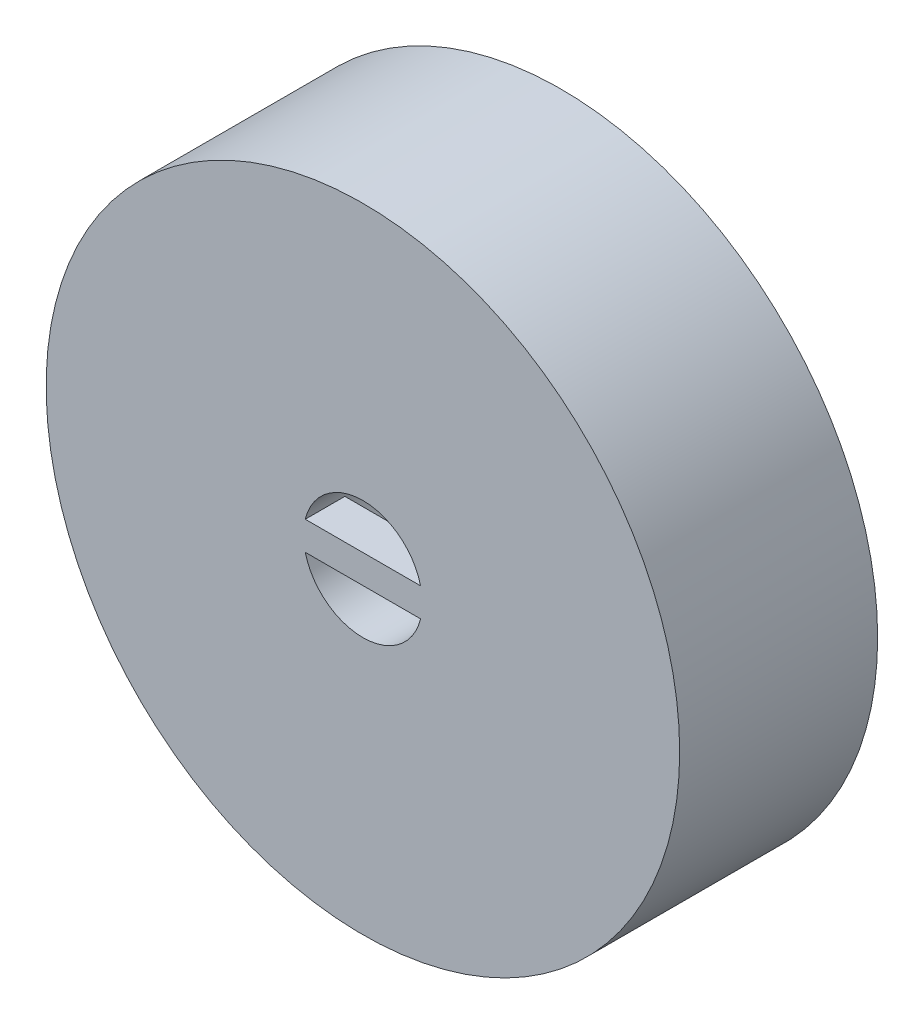
ISO-10303-21;
HEADER;
FILE_DESCRIPTION(('STEP AP214'),'2;1');
FILE_NAME('part.step','',(''),(''),'','','');
FILE_SCHEMA(('AUTOMOTIVE_DESIGN { 1 0 10303 214 1 1 1 1 }'));
ENDSEC;
DATA;
#1=APPLICATION_CONTEXT('core data for automotive mechanical design processes');
#2=APPLICATION_PROTOCOL_DEFINITION('international standard','automotive_design',2000,#1);
#3=PRODUCT_CONTEXT('',#1,'mechanical');
#4=PRODUCT('Part','Part','',(#3));
#5=PRODUCT_RELATED_PRODUCT_CATEGORY('part','',(#4));
#6=PRODUCT_DEFINITION_FORMATION('','',#4);
#7=PRODUCT_DEFINITION_CONTEXT('part definition',#1,'design');
#8=PRODUCT_DEFINITION('design','',#6,#7);
#9=PRODUCT_DEFINITION_SHAPE('','',#8);
#10=(LENGTH_UNIT() NAMED_UNIT(*) SI_UNIT(.MILLI.,.METRE.));
#11=(NAMED_UNIT(*) PLANE_ANGLE_UNIT() SI_UNIT($,.RADIAN.));
#12=(NAMED_UNIT(*) SI_UNIT($,.STERADIAN.) SOLID_ANGLE_UNIT());
#13=UNCERTAINTY_MEASURE_WITH_UNIT(LENGTH_MEASURE(1.E-05),#10,'distance_accuracy_value','');
#14=(GEOMETRIC_REPRESENTATION_CONTEXT(3) GLOBAL_UNCERTAINTY_ASSIGNED_CONTEXT((#13)) GLOBAL_UNIT_ASSIGNED_CONTEXT((#10,
#11,#12)) REPRESENTATION_CONTEXT('',''));
#15=CARTESIAN_POINT('',(0.,0.,0.));
#16=DIRECTION('',(0.,0.,1.));
#17=DIRECTION('',(1.,0.,0.));
#18=AXIS2_PLACEMENT_3D('',#15,#16,#17);
#19=CARTESIAN_POINT('',(0.,0.,1.));
#20=DIRECTION('',(0.,0.,1.));
#21=DIRECTION('',(1.,0.,0.));
#22=AXIS2_PLACEMENT_3D('',#19,#20,#21);
#23=PLANE('',#22);
#24=DIRECTION('',(1.,0.,0.));
#25=VECTOR('',#24,1.);
#26=CARTESIAN_POINT('',(0.,0.0451632546348679,1.));
#27=LINE('',#26,#25);
#28=CARTESIAN_POINT('',(-0.181979478048449,0.0451632546348679,1.));
#29=VERTEX_POINT('',#28);
#30=CARTESIAN_POINT('',(0.181979478048449,0.0451632546348679,1.));
#31=VERTEX_POINT('',#30);
#32=EDGE_CURVE('E55',#29,#31,#27,.T.);
#33=ORIENTED_EDGE('',*,*,#32,.F.);
#34=CARTESIAN_POINT('',(0.,0.,1.));
#35=DIRECTION('',(0.,0.,1.));
#36=DIRECTION('',(1.,0.,0.));
#37=AXIS2_PLACEMENT_3D('',#34,#35,#36);
#38=CIRCLE('',#37,0.1875);
#39=EDGE_CURVE('E92',#31,#29,#38,.T.);
#40=ORIENTED_EDGE('',*,*,#39,.F.);
#41=EDGE_LOOP('',(#33,#40));
#42=FACE_BOUND('',#41,.T.);
#43=CARTESIAN_POINT('',(0.,0.,1.));
#44=DIRECTION('',(0.,0.,1.));
#45=DIRECTION('',(1.,0.,0.));
#46=AXIS2_PLACEMENT_3D('',#43,#44,#45);
#47=CIRCLE('',#46,1.);
#48=CARTESIAN_POINT('',(1.,0.,1.));
#49=VERTEX_POINT('',#48);
#50=EDGE_CURVE('E134',#49,#49,#47,.T.);
#51=ORIENTED_EDGE('',*,*,#50,.T.);
#52=EDGE_LOOP('',(#51));
#53=FACE_BOUND('',#52,.T.);
#54=CARTESIAN_POINT('',(0.,0.,1.));
#55=DIRECTION('',(0.,0.,1.));
#56=DIRECTION('',(1.,0.,0.));
#57=AXIS2_PLACEMENT_3D('',#54,#55,#56);
#58=CIRCLE('',#57,0.1875);
#59=CARTESIAN_POINT('',(-0.181979478048449,-0.0451632546348679,1.));
#60=VERTEX_POINT('',#59);
#61=CARTESIAN_POINT('',(0.181979478048449,-0.0451632546348679,1.));
#62=VERTEX_POINT('',#61);
#63=EDGE_CURVE('E118',#60,#62,#58,.T.);
#64=ORIENTED_EDGE('',*,*,#63,.F.);
#65=DIRECTION('',(1.,0.,0.));
#66=VECTOR('',#65,1.);
#67=CARTESIAN_POINT('',(0.,-0.0451632546348679,1.));
#68=LINE('',#67,#66);
#69=EDGE_CURVE('E63',#60,#62,#68,.T.);
#70=ORIENTED_EDGE('',*,*,#69,.T.);
#71=EDGE_LOOP('',(#64,#70));
#72=FACE_BOUND('',#71,.T.);
#73=ADVANCED_FACE('F39',(#42,#53,#72),#23,.T.);
#74=CARTESIAN_POINT('',(0.,0.,1.));
#75=DIRECTION('',(0.,0.,-1.));
#76=DIRECTION('',(-1.,0.,0.));
#77=AXIS2_PLACEMENT_3D('',#74,#75,#76);
#78=CYLINDRICAL_SURFACE('',#77,1.);
#79=CARTESIAN_POINT('',(0.,0.,0.375));
#80=DIRECTION('',(0.,0.,1.));
#81=DIRECTION('',(1.,0.,0.));
#82=AXIS2_PLACEMENT_3D('',#79,#80,#81);
#83=CIRCLE('',#82,1.);
#84=CARTESIAN_POINT('',(1.,0.,0.375));
#85=VERTEX_POINT('',#84);
#86=EDGE_CURVE('E130',#85,#85,#83,.T.);
#87=ORIENTED_EDGE('',*,*,#86,.T.);
#88=EDGE_LOOP('',(#87));
#89=FACE_BOUND('',#88,.T.);
#90=ORIENTED_EDGE('',*,*,#50,.F.);
#91=EDGE_LOOP('',(#90));
#92=FACE_BOUND('',#91,.T.);
#93=ADVANCED_FACE('F158',(#89,#92),#78,.T.);
#94=CARTESIAN_POINT('',(0.,0.,0.375));
#95=DIRECTION('',(0.,0.,1.));
#96=DIRECTION('',(1.,0.,0.));
#97=AXIS2_PLACEMENT_3D('',#94,#95,#96);
#98=PLANE('',#97);
#99=CARTESIAN_POINT('',(0.,0.,0.375));
#100=DIRECTION('',(0.,0.,1.));
#101=DIRECTION('',(1.,0.,0.));
#102=AXIS2_PLACEMENT_3D('',#99,#100,#101);
#103=CIRCLE('',#102,0.475);
#104=CARTESIAN_POINT('',(0.475,0.,0.375));
#105=VERTEX_POINT('',#104);
#106=EDGE_CURVE('E48',#105,#105,#103,.T.);
#107=ORIENTED_EDGE('',*,*,#106,.T.);
#108=EDGE_LOOP('',(#107));
#109=FACE_BOUND('',#108,.T.);
#110=ORIENTED_EDGE('',*,*,#86,.F.);
#111=EDGE_LOOP('',(#110));
#112=FACE_BOUND('',#111,.T.);
#113=ADVANCED_FACE('F141',(#109,#112),#98,.F.);
#114=CARTESIAN_POINT('',(0.,0.,0.375));
#115=DIRECTION('',(0.,0.,-1.));
#116=DIRECTION('',(-1.,0.,0.));
#117=AXIS2_PLACEMENT_3D('',#114,#115,#116);
#118=CYLINDRICAL_SURFACE('',#117,0.375);
#119=CARTESIAN_POINT('',(0.,0.,0.275));
#120=DIRECTION('',(0.,0.,1.));
#121=DIRECTION('',(1.,0.,0.));
#122=AXIS2_PLACEMENT_3D('',#119,#120,#121);
#123=CIRCLE('',#122,0.375);
#124=CARTESIAN_POINT('',(0.375,0.,0.275));
#125=VERTEX_POINT('',#124);
#126=EDGE_CURVE('E11',#125,#125,#123,.F.);
#127=ORIENTED_EDGE('',*,*,#126,.T.);
#128=EDGE_LOOP('',(#127));
#129=FACE_BOUND('',#128,.T.);
#130=CARTESIAN_POINT('',(0.,0.,0.));
#131=DIRECTION('',(0.,0.,1.));
#132=DIRECTION('',(1.,0.,0.));
#133=AXIS2_PLACEMENT_3D('',#130,#131,#132);
#134=CIRCLE('',#133,0.375);
#135=CARTESIAN_POINT('',(0.375,0.,0.));
#136=VERTEX_POINT('',#135);
#137=EDGE_CURVE('E110',#136,#136,#134,.T.);
#138=ORIENTED_EDGE('',*,*,#137,.T.);
#139=EDGE_LOOP('',(#138));
#140=FACE_BOUND('',#139,.T.);
#141=ADVANCED_FACE('F153',(#129,#140),#118,.T.);
#142=CARTESIAN_POINT('',(0.,0.,0.));
#143=DIRECTION('',(0.,0.,1.));
#144=DIRECTION('',(1.,0.,0.));
#145=AXIS2_PLACEMENT_3D('',#142,#143,#144);
#146=PLANE('',#145);
#147=CARTESIAN_POINT('',(0.,0.,0.));
#148=DIRECTION('',(0.,0.,1.));
#149=DIRECTION('',(1.,0.,0.));
#150=AXIS2_PLACEMENT_3D('',#147,#148,#149);
#151=CIRCLE('',#150,0.1875);
#152=CARTESIAN_POINT('',(0.1875,0.,0.));
#153=VERTEX_POINT('',#152);
#154=EDGE_CURVE('E103',#153,#153,#151,.T.);
#155=ORIENTED_EDGE('',*,*,#154,.T.);
#156=EDGE_LOOP('',(#155));
#157=FACE_BOUND('',#156,.T.);
#158=ORIENTED_EDGE('',*,*,#137,.F.);
#159=EDGE_LOOP('',(#158));
#160=FACE_BOUND('',#159,.T.);
#161=ADVANCED_FACE('F146',(#157,#160),#146,.F.);
#162=CARTESIAN_POINT('',(0.,0.,0.275));
#163=DIRECTION('',(0.,0.,1.));
#164=DIRECTION('',(1.,0.,0.));
#165=AXIS2_PLACEMENT_3D('',#162,#163,#164);
#166=TOROIDAL_SURFACE('',#165,0.475,0.1);
#167=ORIENTED_EDGE('',*,*,#126,.F.);
#168=EDGE_LOOP('',(#167));
#169=FACE_BOUND('',#168,.T.);
#170=ORIENTED_EDGE('',*,*,#106,.F.);
#171=EDGE_LOOP('',(#170));
#172=FACE_BOUND('',#171,.T.);
#173=ADVANCED_FACE('F41',(#169,#172),#166,.F.);
#174=CARTESIAN_POINT('',(0.,-0.0451632546348679,0.875));
#175=DIRECTION('',(0.,-1.,0.));
#176=DIRECTION('',(0.,0.,-1.));
#177=AXIS2_PLACEMENT_3D('',#174,#175,#176);
#178=PLANE('',#177);
#179=ORIENTED_EDGE('',*,*,#69,.F.);
#180=DIRECTION('',(0.,0.,1.));
#181=VECTOR('',#180,1.);
#182=CARTESIAN_POINT('',(-0.181979478048449,-0.0451632546348679,0.875));
#183=LINE('',#182,#181);
#184=CARTESIAN_POINT('',(-0.181979478048449,-0.0451632546348679,0.875));
#185=VERTEX_POINT('',#184);
#186=EDGE_CURVE('E117',#185,#60,#183,.T.);
#187=ORIENTED_EDGE('',*,*,#186,.F.);
#188=DIRECTION('',(1.,0.,0.));
#189=VECTOR('',#188,1.);
#190=CARTESIAN_POINT('',(0.,-0.0451632546348679,0.875));
#191=LINE('',#190,#189);
#192=CARTESIAN_POINT('',(0.181979478048449,-0.0451632546348679,0.875));
#193=VERTEX_POINT('',#192);
#194=EDGE_CURVE('E114',#185,#193,#191,.T.);
#195=ORIENTED_EDGE('',*,*,#194,.T.);
#196=DIRECTION('',(0.,0.,1.));
#197=VECTOR('',#196,1.);
#198=CARTESIAN_POINT('',(0.181979478048449,-0.0451632546348679,0.875));
#199=LINE('',#198,#197);
#200=EDGE_CURVE('E101',#193,#62,#199,.T.);
#201=ORIENTED_EDGE('',*,*,#200,.T.);
#202=EDGE_LOOP('',(#179,#187,#195,#201));
#203=FACE_BOUND('',#202,.T.);
#204=ADVANCED_FACE('F145',(#203),#178,.T.);
#205=CARTESIAN_POINT('',(0.,0.0451632546348679,0.875));
#206=DIRECTION('',(0.,-1.,0.));
#207=DIRECTION('',(0.,0.,-1.));
#208=AXIS2_PLACEMENT_3D('',#205,#206,#207);
#209=PLANE('',#208);
#210=ORIENTED_EDGE('',*,*,#32,.T.);
#211=DIRECTION('',(0.,0.,1.));
#212=VECTOR('',#211,1.);
#213=CARTESIAN_POINT('',(0.181979478048449,0.0451632546348679,0.875));
#214=LINE('',#213,#212);
#215=CARTESIAN_POINT('',(0.181979478048449,0.0451632546348679,0.875));
#216=VERTEX_POINT('',#215);
#217=EDGE_CURVE('E91',#216,#31,#214,.T.);
#218=ORIENTED_EDGE('',*,*,#217,.F.);
#219=DIRECTION('',(1.,0.,0.));
#220=VECTOR('',#219,1.);
#221=CARTESIAN_POINT('',(0.,0.0451632546348679,0.875));
#222=LINE('',#221,#220);
#223=CARTESIAN_POINT('',(-0.181979478048449,0.0451632546348679,0.875));
#224=VERTEX_POINT('',#223);
#225=EDGE_CURVE('E82',#224,#216,#222,.T.);
#226=ORIENTED_EDGE('',*,*,#225,.F.);
#227=DIRECTION('',(0.,0.,1.));
#228=VECTOR('',#227,1.);
#229=CARTESIAN_POINT('',(-0.181979478048449,0.0451632546348679,0.875));
#230=LINE('',#229,#228);
#231=EDGE_CURVE('E107',#224,#29,#230,.T.);
#232=ORIENTED_EDGE('',*,*,#231,.T.);
#233=EDGE_LOOP('',(#210,#218,#226,#232));
#234=FACE_BOUND('',#233,.T.);
#235=ADVANCED_FACE('F105',(#234),#209,.F.);
#236=CARTESIAN_POINT('',(0.,0.,0.875));
#237=DIRECTION('',(0.,0.,1.));
#238=DIRECTION('',(1.,0.,0.));
#239=AXIS2_PLACEMENT_3D('',#236,#237,#238);
#240=CYLINDRICAL_SURFACE('',#239,0.1875);
#241=ORIENTED_EDGE('',*,*,#39,.T.);
#242=ORIENTED_EDGE('',*,*,#231,.F.);
#243=CARTESIAN_POINT('',(0.,0.,0.875));
#244=DIRECTION('',(0.,0.,1.));
#245=DIRECTION('',(1.,0.,0.));
#246=AXIS2_PLACEMENT_3D('',#243,#244,#245);
#247=CIRCLE('',#246,0.1875);
#248=EDGE_CURVE('E88',#224,#185,#247,.T.);
#249=ORIENTED_EDGE('',*,*,#248,.T.);
#250=ORIENTED_EDGE('',*,*,#186,.T.);
#251=ORIENTED_EDGE('',*,*,#63,.T.);
#252=ORIENTED_EDGE('',*,*,#200,.F.);
#253=EDGE_CURVE('E85',#193,#216,#247,.T.);
#254=ORIENTED_EDGE('',*,*,#253,.T.);
#255=ORIENTED_EDGE('',*,*,#217,.T.);
#256=EDGE_LOOP('',(#241,#242,#249,#250,#251,#252,#254,#255));
#257=FACE_BOUND('',#256,.T.);
#258=ORIENTED_EDGE('',*,*,#154,.F.);
#259=EDGE_LOOP('',(#258));
#260=FACE_BOUND('',#259,.T.);
#261=ADVANCED_FACE('F97',(#257,#260),#240,.F.);
#262=CARTESIAN_POINT('',(0.,0.,0.875));
#263=DIRECTION('',(0.,0.,1.));
#264=DIRECTION('',(1.,0.,0.));
#265=AXIS2_PLACEMENT_3D('',#262,#263,#264);
#266=PLANE('',#265);
#267=ORIENTED_EDGE('',*,*,#248,.F.);
#268=ORIENTED_EDGE('',*,*,#225,.T.);
#269=ORIENTED_EDGE('',*,*,#253,.F.);
#270=ORIENTED_EDGE('',*,*,#194,.F.);
#271=EDGE_LOOP('',(#267,#268,#269,#270));
#272=FACE_BOUND('',#271,.T.);
#273=ADVANCED_FACE('F84',(#272),#266,.F.);
#274=CLOSED_SHELL('',(#73,#93,#113,#141,#161,#173,#204,#235,#261,#273));
#275=MANIFOLD_SOLID_BREP('B2',#274);
#276=ADVANCED_BREP_SHAPE_REPRESENTATION('',(#18,#275),#14);
#277=SHAPE_DEFINITION_REPRESENTATION(#9,#276);
ENDSEC;
END-ISO-10303-21;
